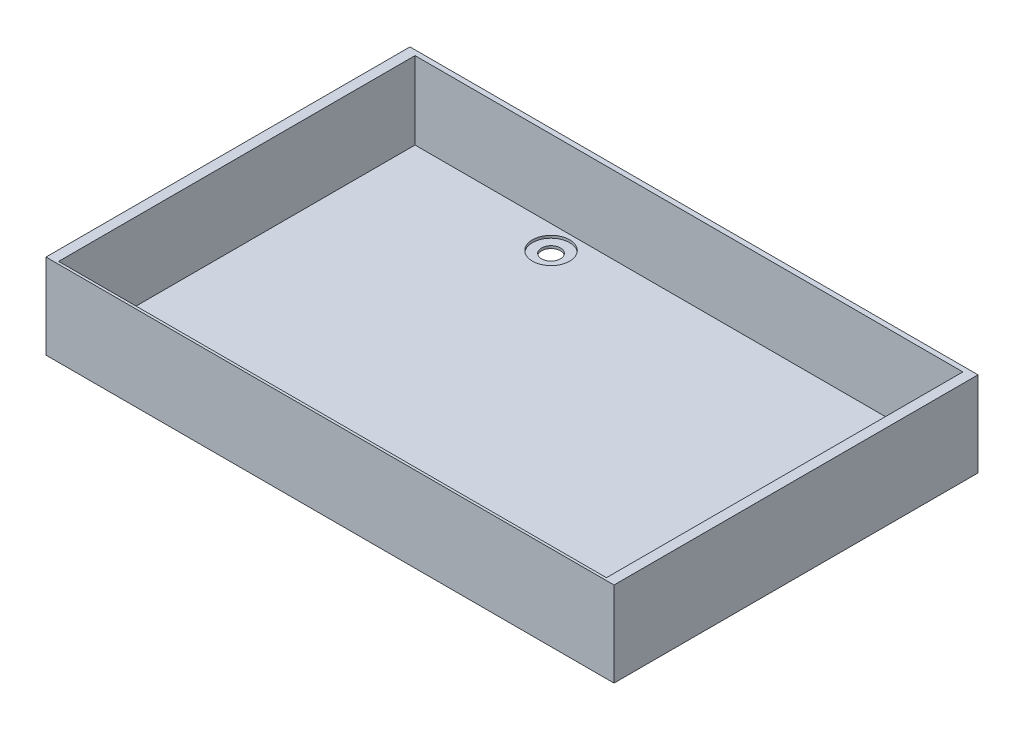
ISO-10303-21;
HEADER;
FILE_DESCRIPTION(('STEP AP214'),'2;1');
FILE_NAME('part.step','',(''),(''),'','','');
FILE_SCHEMA(('AUTOMOTIVE_DESIGN { 1 0 10303 214 1 1 1 1 }'));
ENDSEC;
DATA;
#1=APPLICATION_CONTEXT('core data for automotive mechanical design processes');
#2=APPLICATION_PROTOCOL_DEFINITION('international standard','automotive_design',2000,#1);
#3=PRODUCT_CONTEXT('',#1,'mechanical');
#4=PRODUCT('Part','Part','',(#3));
#5=PRODUCT_RELATED_PRODUCT_CATEGORY('part','',(#4));
#6=PRODUCT_DEFINITION_FORMATION('','',#4);
#7=PRODUCT_DEFINITION_CONTEXT('part definition',#1,'design');
#8=PRODUCT_DEFINITION('design','',#6,#7);
#9=PRODUCT_DEFINITION_SHAPE('','',#8);
#10=(LENGTH_UNIT() NAMED_UNIT(*) SI_UNIT(.MILLI.,.METRE.));
#11=(NAMED_UNIT(*) PLANE_ANGLE_UNIT() SI_UNIT($,.RADIAN.));
#12=(NAMED_UNIT(*) SI_UNIT($,.STERADIAN.) SOLID_ANGLE_UNIT());
#13=UNCERTAINTY_MEASURE_WITH_UNIT(LENGTH_MEASURE(1.E-05),#10,'distance_accuracy_value','');
#14=(GEOMETRIC_REPRESENTATION_CONTEXT(3) GLOBAL_UNCERTAINTY_ASSIGNED_CONTEXT((#13)) GLOBAL_UNIT_ASSIGNED_CONTEXT((#10,
#11,#12)) REPRESENTATION_CONTEXT('',''));
#15=CARTESIAN_POINT('',(0.,0.,0.));
#16=DIRECTION('',(0.,0.,1.));
#17=DIRECTION('',(1.,0.,0.));
#18=AXIS2_PLACEMENT_3D('',#15,#16,#17);
#19=CARTESIAN_POINT('',(84.9,-1.2,-53.3));
#20=DIRECTION('',(0.,1.,0.));
#21=DIRECTION('',(0.,0.,1.));
#22=AXIS2_PLACEMENT_3D('',#19,#20,#21);
#23=CYLINDRICAL_SURFACE('',#22,1.5);
#24=CARTESIAN_POINT('',(84.9,-0.8,-53.3));
#25=DIRECTION('',(0.,1.,0.));
#26=DIRECTION('',(0.,0.,1.));
#27=AXIS2_PLACEMENT_3D('',#24,#25,#26);
#28=CIRCLE('',#27,1.5);
#29=CARTESIAN_POINT('',(84.9,-0.8,-51.8));
#30=VERTEX_POINT('',#29);
#31=EDGE_CURVE('E122',#30,#30,#28,.F.);
#32=ORIENTED_EDGE('',*,*,#31,.T.);
#33=EDGE_LOOP('',(#32));
#34=FACE_BOUND('',#33,.T.);
#35=CARTESIAN_POINT('',(84.9,-0.4,-53.3));
#36=DIRECTION('',(0.,1.,0.));
#37=DIRECTION('',(0.,0.,1.));
#38=AXIS2_PLACEMENT_3D('',#35,#36,#37);
#39=CIRCLE('',#38,1.5);
#40=CARTESIAN_POINT('',(84.9,-0.4,-51.8));
#41=VERTEX_POINT('',#40);
#42=EDGE_CURVE('E39',#41,#41,#39,.F.);
#43=ORIENTED_EDGE('',*,*,#42,.F.);
#44=EDGE_LOOP('',(#43));
#45=FACE_BOUND('',#44,.T.);
#46=ADVANCED_FACE('F35',(#34,#45),#23,.F.);
#47=CARTESIAN_POINT('',(26.9,-1.2,-4.3));
#48=DIRECTION('',(0.,1.,0.));
#49=DIRECTION('',(0.,0.,1.));
#50=AXIS2_PLACEMENT_3D('',#47,#48,#49);
#51=CYLINDRICAL_SURFACE('',#50,1.5);
#52=CARTESIAN_POINT('',(26.9,-0.8,-4.3));
#53=DIRECTION('',(0.,1.,0.));
#54=DIRECTION('',(0.,0.,1.));
#55=AXIS2_PLACEMENT_3D('',#52,#53,#54);
#56=CIRCLE('',#55,1.5);
#57=CARTESIAN_POINT('',(26.9,-0.8,-2.8));
#58=VERTEX_POINT('',#57);
#59=EDGE_CURVE('E174',#58,#58,#56,.F.);
#60=ORIENTED_EDGE('',*,*,#59,.T.);
#61=EDGE_LOOP('',(#60));
#62=FACE_BOUND('',#61,.T.);
#63=CARTESIAN_POINT('',(26.9,-0.4,-4.3));
#64=DIRECTION('',(0.,1.,0.));
#65=DIRECTION('',(0.,0.,1.));
#66=AXIS2_PLACEMENT_3D('',#63,#64,#65);
#67=CIRCLE('',#66,1.5);
#68=CARTESIAN_POINT('',(26.9,-0.4,-2.8));
#69=VERTEX_POINT('',#68);
#70=EDGE_CURVE('E185',#69,#69,#67,.F.);
#71=ORIENTED_EDGE('',*,*,#70,.F.);
#72=EDGE_LOOP('',(#71));
#73=FACE_BOUND('',#72,.T.);
#74=ADVANCED_FACE('F239',(#62,#73),#51,.F.);
#75=CARTESIAN_POINT('',(84.9,-1.2,-4.3));
#76=DIRECTION('',(0.,1.,0.));
#77=DIRECTION('',(0.,0.,1.));
#78=AXIS2_PLACEMENT_3D('',#75,#76,#77);
#79=CYLINDRICAL_SURFACE('',#78,1.5);
#80=CARTESIAN_POINT('',(84.9,-0.8,-4.3));
#81=DIRECTION('',(0.,1.,0.));
#82=DIRECTION('',(0.,0.,1.));
#83=AXIS2_PLACEMENT_3D('',#80,#81,#82);
#84=CIRCLE('',#83,1.5);
#85=CARTESIAN_POINT('',(84.9,-0.8,-2.8));
#86=VERTEX_POINT('',#85);
#87=EDGE_CURVE('E170',#86,#86,#84,.F.);
#88=ORIENTED_EDGE('',*,*,#87,.T.);
#89=EDGE_LOOP('',(#88));
#90=FACE_BOUND('',#89,.T.);
#91=CARTESIAN_POINT('',(84.9,-0.4,-4.3));
#92=DIRECTION('',(0.,1.,0.));
#93=DIRECTION('',(0.,0.,1.));
#94=AXIS2_PLACEMENT_3D('',#91,#92,#93);
#95=CIRCLE('',#94,1.5);
#96=CARTESIAN_POINT('',(84.9,-0.4,-2.8));
#97=VERTEX_POINT('',#96);
#98=EDGE_CURVE('E182',#97,#97,#95,.F.);
#99=ORIENTED_EDGE('',*,*,#98,.F.);
#100=EDGE_LOOP('',(#99));
#101=FACE_BOUND('',#100,.T.);
#102=ADVANCED_FACE('F245',(#90,#101),#79,.F.);
#103=CARTESIAN_POINT('',(26.9,-1.2,-53.3));
#104=DIRECTION('',(0.,1.,0.));
#105=DIRECTION('',(0.,0.,1.));
#106=AXIS2_PLACEMENT_3D('',#103,#104,#105);
#107=CYLINDRICAL_SURFACE('',#106,1.5);
#108=CARTESIAN_POINT('',(26.9,-0.8,-53.3));
#109=DIRECTION('',(0.,1.,0.));
#110=DIRECTION('',(0.,0.,1.));
#111=AXIS2_PLACEMENT_3D('',#108,#109,#110);
#112=CIRCLE('',#111,1.5);
#113=CARTESIAN_POINT('',(26.9,-0.8,-51.8));
#114=VERTEX_POINT('',#113);
#115=EDGE_CURVE('E167',#114,#114,#112,.F.);
#116=ORIENTED_EDGE('',*,*,#115,.T.);
#117=EDGE_LOOP('',(#116));
#118=FACE_BOUND('',#117,.T.);
#119=CARTESIAN_POINT('',(26.9,-0.4,-53.3));
#120=DIRECTION('',(0.,1.,0.));
#121=DIRECTION('',(0.,0.,1.));
#122=AXIS2_PLACEMENT_3D('',#119,#120,#121);
#123=CIRCLE('',#122,1.5);
#124=CARTESIAN_POINT('',(26.9,-0.4,-51.8));
#125=VERTEX_POINT('',#124);
#126=EDGE_CURVE('E179',#125,#125,#123,.F.);
#127=ORIENTED_EDGE('',*,*,#126,.F.);
#128=EDGE_LOOP('',(#127));
#129=FACE_BOUND('',#128,.T.);
#130=ADVANCED_FACE('F277',(#118,#129),#107,.F.);
#131=CARTESIAN_POINT('',(0.,12.3,0.));
#132=DIRECTION('',(0.,-1.,0.));
#133=DIRECTION('',(0.,0.,-1.));
#134=AXIS2_PLACEMENT_3D('',#131,#132,#133);
#135=PLANE('',#134);
#136=DIRECTION('',(0.,0.,1.));
#137=VECTOR('',#136,1.);
#138=CARTESIAN_POINT('',(0.,12.3,0.));
#139=LINE('',#138,#137);
#140=CARTESIAN_POINT('',(0.,12.3,-57.8));
#141=VERTEX_POINT('',#140);
#142=CARTESIAN_POINT('',(0.,12.3,0.));
#143=VERTEX_POINT('',#142);
#144=EDGE_CURVE('E156',#141,#143,#139,.T.);
#145=ORIENTED_EDGE('',*,*,#144,.T.);
#146=DIRECTION('',(1.,0.,0.));
#147=VECTOR('',#146,1.);
#148=CARTESIAN_POINT('',(0.,12.3,0.));
#149=LINE('',#148,#147);
#150=CARTESIAN_POINT('',(90.2,12.3,0.));
#151=VERTEX_POINT('',#150);
#152=EDGE_CURVE('E159',#143,#151,#149,.T.);
#153=ORIENTED_EDGE('',*,*,#152,.T.);
#154=DIRECTION('',(0.,0.,-1.));
#155=VECTOR('',#154,1.);
#156=CARTESIAN_POINT('',(90.2,12.3,0.));
#157=LINE('',#156,#155);
#158=CARTESIAN_POINT('',(90.2,12.3,-57.8));
#159=VERTEX_POINT('',#158);
#160=EDGE_CURVE('E108',#151,#159,#157,.T.);
#161=ORIENTED_EDGE('',*,*,#160,.T.);
#162=DIRECTION('',(-1.,0.,0.));
#163=VECTOR('',#162,1.);
#164=CARTESIAN_POINT('',(0.,12.3,-57.8));
#165=LINE('',#164,#163);
#166=EDGE_CURVE('E162',#159,#141,#165,.T.);
#167=ORIENTED_EDGE('',*,*,#166,.T.);
#168=EDGE_LOOP('',(#145,#153,#161,#167));
#169=FACE_BOUND('',#168,.T.);
#170=DIRECTION('',(0.,0.,1.));
#171=VECTOR('',#170,1.);
#172=CARTESIAN_POINT('',(1.6,12.3,-0.4));
#173=LINE('',#172,#171);
#174=CARTESIAN_POINT('',(1.6,12.3,-57.));
#175=VERTEX_POINT('',#174);
#176=CARTESIAN_POINT('',(1.6,12.3,-0.4));
#177=VERTEX_POINT('',#176);
#178=EDGE_CURVE('E133',#175,#177,#173,.T.);
#179=ORIENTED_EDGE('',*,*,#178,.F.);
#180=DIRECTION('',(-1.,0.,0.));
#181=VECTOR('',#180,1.);
#182=CARTESIAN_POINT('',(1.6,12.3,-57.));
#183=LINE('',#182,#181);
#184=CARTESIAN_POINT('',(88.6,12.3,-57.));
#185=VERTEX_POINT('',#184);
#186=EDGE_CURVE('E140',#185,#175,#183,.T.);
#187=ORIENTED_EDGE('',*,*,#186,.F.);
#188=DIRECTION('',(0.,0.,-1.));
#189=VECTOR('',#188,1.);
#190=CARTESIAN_POINT('',(88.6,12.3,-0.4));
#191=LINE('',#190,#189);
#192=CARTESIAN_POINT('',(88.6,12.3,-0.4));
#193=VERTEX_POINT('',#192);
#194=EDGE_CURVE('E138',#193,#185,#191,.T.);
#195=ORIENTED_EDGE('',*,*,#194,.F.);
#196=DIRECTION('',(1.,0.,0.));
#197=VECTOR('',#196,1.);
#198=CARTESIAN_POINT('',(1.6,12.3,-0.4));
#199=LINE('',#198,#197);
#200=EDGE_CURVE('E135',#177,#193,#199,.T.);
#201=ORIENTED_EDGE('',*,*,#200,.F.);
#202=EDGE_LOOP('',(#179,#187,#195,#201));
#203=FACE_BOUND('',#202,.T.);
#204=ADVANCED_FACE('F274',(#169,#203),#135,.F.);
#205=CARTESIAN_POINT('',(0.,12.3,0.));
#206=DIRECTION('',(1.,0.,0.));
#207=DIRECTION('',(0.,0.,-1.));
#208=AXIS2_PLACEMENT_3D('',#205,#206,#207);
#209=PLANE('',#208);
#210=DIRECTION('',(0.,-1.,0.));
#211=VECTOR('',#210,1.);
#212=CARTESIAN_POINT('',(0.,12.3,-57.8));
#213=LINE('',#212,#211);
#214=CARTESIAN_POINT('',(0.,-1.20000000000001,-57.8));
#215=VERTEX_POINT('',#214);
#216=EDGE_CURVE('E164',#141,#215,#213,.T.);
#217=ORIENTED_EDGE('',*,*,#216,.T.);
#218=DIRECTION('',(0.,0.,-1.));
#219=VECTOR('',#218,1.);
#220=CARTESIAN_POINT('',(0.,-1.20000000000001,0.));
#221=LINE('',#220,#219);
#222=CARTESIAN_POINT('',(0.,-1.20000000000001,0.));
#223=VERTEX_POINT('',#222);
#224=EDGE_CURVE('E126',#223,#215,#221,.T.);
#225=ORIENTED_EDGE('',*,*,#224,.F.);
#226=DIRECTION('',(0.,-1.,0.));
#227=VECTOR('',#226,1.);
#228=CARTESIAN_POINT('',(0.,12.3,0.));
#229=LINE('',#228,#227);
#230=EDGE_CURVE('E11',#143,#223,#229,.T.);
#231=ORIENTED_EDGE('',*,*,#230,.F.);
#232=ORIENTED_EDGE('',*,*,#144,.F.);
#233=EDGE_LOOP('',(#217,#225,#231,#232));
#234=FACE_BOUND('',#233,.T.);
#235=ADVANCED_FACE('F37',(#234),#209,.F.);
#236=CARTESIAN_POINT('',(0.,12.3,0.));
#237=DIRECTION('',(0.,0.,-1.));
#238=DIRECTION('',(-1.,0.,0.));
#239=AXIS2_PLACEMENT_3D('',#236,#237,#238);
#240=PLANE('',#239);
#241=ORIENTED_EDGE('',*,*,#230,.T.);
#242=DIRECTION('',(-1.,0.,0.));
#243=VECTOR('',#242,1.);
#244=CARTESIAN_POINT('',(0.,-1.20000000000001,0.));
#245=LINE('',#244,#243);
#246=CARTESIAN_POINT('',(90.2,-1.20000000000001,0.));
#247=VERTEX_POINT('',#246);
#248=EDGE_CURVE('E118',#247,#223,#245,.T.);
#249=ORIENTED_EDGE('',*,*,#248,.F.);
#250=DIRECTION('',(0.,-1.,0.));
#251=VECTOR('',#250,1.);
#252=CARTESIAN_POINT('',(90.2,12.3,0.));
#253=LINE('',#252,#251);
#254=EDGE_CURVE('E44',#151,#247,#253,.T.);
#255=ORIENTED_EDGE('',*,*,#254,.F.);
#256=ORIENTED_EDGE('',*,*,#152,.F.);
#257=EDGE_LOOP('',(#241,#249,#255,#256));
#258=FACE_BOUND('',#257,.T.);
#259=ADVANCED_FACE('F124',(#258),#240,.F.);
#260=CARTESIAN_POINT('',(90.2,12.3,0.));
#261=DIRECTION('',(-1.,0.,0.));
#262=DIRECTION('',(0.,0.,1.));
#263=AXIS2_PLACEMENT_3D('',#260,#261,#262);
#264=PLANE('',#263);
#265=ORIENTED_EDGE('',*,*,#254,.T.);
#266=DIRECTION('',(0.,0.,1.));
#267=VECTOR('',#266,1.);
#268=CARTESIAN_POINT('',(90.2,-1.20000000000001,0.));
#269=LINE('',#268,#267);
#270=CARTESIAN_POINT('',(90.2,-1.20000000000001,-57.8));
#271=VERTEX_POINT('',#270);
#272=EDGE_CURVE('E107',#271,#247,#269,.T.);
#273=ORIENTED_EDGE('',*,*,#272,.F.);
#274=DIRECTION('',(0.,-1.,0.));
#275=VECTOR('',#274,1.);
#276=CARTESIAN_POINT('',(90.2,12.3,-57.8));
#277=LINE('',#276,#275);
#278=EDGE_CURVE('E111',#159,#271,#277,.T.);
#279=ORIENTED_EDGE('',*,*,#278,.F.);
#280=ORIENTED_EDGE('',*,*,#160,.F.);
#281=EDGE_LOOP('',(#265,#273,#279,#280));
#282=FACE_BOUND('',#281,.T.);
#283=ADVANCED_FACE('F105',(#282),#264,.F.);
#284=CARTESIAN_POINT('',(0.,12.3,-57.8));
#285=DIRECTION('',(0.,0.,1.));
#286=DIRECTION('',(1.,0.,0.));
#287=AXIS2_PLACEMENT_3D('',#284,#285,#286);
#288=PLANE('',#287);
#289=ORIENTED_EDGE('',*,*,#278,.T.);
#290=DIRECTION('',(1.,0.,0.));
#291=VECTOR('',#290,1.);
#292=CARTESIAN_POINT('',(0.,-1.20000000000001,-57.8));
#293=LINE('',#292,#291);
#294=EDGE_CURVE('E121',#215,#271,#293,.T.);
#295=ORIENTED_EDGE('',*,*,#294,.F.);
#296=ORIENTED_EDGE('',*,*,#216,.F.);
#297=ORIENTED_EDGE('',*,*,#166,.F.);
#298=EDGE_LOOP('',(#289,#295,#296,#297));
#299=FACE_BOUND('',#298,.T.);
#300=ADVANCED_FACE('F273',(#299),#288,.F.);
#301=CARTESIAN_POINT('',(1.6,12.3,-0.4));
#302=DIRECTION('',(1.,0.,0.));
#303=DIRECTION('',(0.,0.,-1.));
#304=AXIS2_PLACEMENT_3D('',#301,#302,#303);
#305=PLANE('',#304);
#306=DIRECTION('',(0.,0.,1.));
#307=VECTOR('',#306,1.);
#308=CARTESIAN_POINT('',(1.6,0.,-0.4));
#309=LINE('',#308,#307);
#310=CARTESIAN_POINT('',(1.6,0.,-57.));
#311=VERTEX_POINT('',#310);
#312=CARTESIAN_POINT('',(1.6,0.,-0.4));
#313=VERTEX_POINT('',#312);
#314=EDGE_CURVE('E60',#311,#313,#309,.T.);
#315=ORIENTED_EDGE('',*,*,#314,.F.);
#316=DIRECTION('',(0.,-1.,0.));
#317=VECTOR('',#316,1.);
#318=CARTESIAN_POINT('',(1.6,12.3,-57.));
#319=LINE('',#318,#317);
#320=EDGE_CURVE('E141',#175,#311,#319,.T.);
#321=ORIENTED_EDGE('',*,*,#320,.F.);
#322=ORIENTED_EDGE('',*,*,#178,.T.);
#323=DIRECTION('',(0.,-1.,0.));
#324=VECTOR('',#323,1.);
#325=CARTESIAN_POINT('',(1.6,12.3,-0.4));
#326=LINE('',#325,#324);
#327=EDGE_CURVE('E154',#177,#313,#326,.T.);
#328=ORIENTED_EDGE('',*,*,#327,.T.);
#329=EDGE_LOOP('',(#315,#321,#322,#328));
#330=FACE_BOUND('',#329,.T.);
#331=ADVANCED_FACE('F269',(#330),#305,.T.);
#332=CARTESIAN_POINT('',(1.6,12.3,-0.4));
#333=DIRECTION('',(0.,0.,-1.));
#334=DIRECTION('',(-1.,0.,0.));
#335=AXIS2_PLACEMENT_3D('',#332,#333,#334);
#336=PLANE('',#335);
#337=DIRECTION('',(1.,0.,0.));
#338=VECTOR('',#337,1.);
#339=CARTESIAN_POINT('',(1.6,0.,-0.4));
#340=LINE('',#339,#338);
#341=CARTESIAN_POINT('',(88.6,0.,-0.4));
#342=VERTEX_POINT('',#341);
#343=EDGE_CURVE('E128',#313,#342,#340,.T.);
#344=ORIENTED_EDGE('',*,*,#343,.F.);
#345=ORIENTED_EDGE('',*,*,#327,.F.);
#346=ORIENTED_EDGE('',*,*,#200,.T.);
#347=DIRECTION('',(0.,-1.,0.));
#348=VECTOR('',#347,1.);
#349=CARTESIAN_POINT('',(88.6,12.3,-0.4));
#350=LINE('',#349,#348);
#351=EDGE_CURVE('E152',#193,#342,#350,.T.);
#352=ORIENTED_EDGE('',*,*,#351,.T.);
#353=EDGE_LOOP('',(#344,#345,#346,#352));
#354=FACE_BOUND('',#353,.T.);
#355=ADVANCED_FACE('F265',(#354),#336,.T.);
#356=CARTESIAN_POINT('',(88.6,12.3,-0.4));
#357=DIRECTION('',(-1.,0.,0.));
#358=DIRECTION('',(0.,0.,1.));
#359=AXIS2_PLACEMENT_3D('',#356,#357,#358);
#360=PLANE('',#359);
#361=DIRECTION('',(0.,0.,-1.));
#362=VECTOR('',#361,1.);
#363=CARTESIAN_POINT('',(88.6,0.,-0.4));
#364=LINE('',#363,#362);
#365=CARTESIAN_POINT('',(88.6,0.,-57.));
#366=VERTEX_POINT('',#365);
#367=EDGE_CURVE('E145',#342,#366,#364,.T.);
#368=ORIENTED_EDGE('',*,*,#367,.F.);
#369=ORIENTED_EDGE('',*,*,#351,.F.);
#370=ORIENTED_EDGE('',*,*,#194,.T.);
#371=DIRECTION('',(0.,-1.,0.));
#372=VECTOR('',#371,1.);
#373=CARTESIAN_POINT('',(88.6,12.3,-57.));
#374=LINE('',#373,#372);
#375=EDGE_CURVE('E52',#185,#366,#374,.T.);
#376=ORIENTED_EDGE('',*,*,#375,.T.);
#377=EDGE_LOOP('',(#368,#369,#370,#376));
#378=FACE_BOUND('',#377,.T.);
#379=ADVANCED_FACE('F262',(#378),#360,.T.);
#380=CARTESIAN_POINT('',(1.6,12.3,-57.));
#381=DIRECTION('',(0.,0.,1.));
#382=DIRECTION('',(1.,0.,0.));
#383=AXIS2_PLACEMENT_3D('',#380,#381,#382);
#384=PLANE('',#383);
#385=DIRECTION('',(-1.,0.,0.));
#386=VECTOR('',#385,1.);
#387=CARTESIAN_POINT('',(1.6,0.,-57.));
#388=LINE('',#387,#386);
#389=EDGE_CURVE('E136',#366,#311,#388,.T.);
#390=ORIENTED_EDGE('',*,*,#389,.F.);
#391=ORIENTED_EDGE('',*,*,#375,.F.);
#392=ORIENTED_EDGE('',*,*,#186,.T.);
#393=ORIENTED_EDGE('',*,*,#320,.T.);
#394=EDGE_LOOP('',(#390,#391,#392,#393));
#395=FACE_BOUND('',#394,.T.);
#396=ADVANCED_FACE('F258',(#395),#384,.T.);
#397=CARTESIAN_POINT('',(0.,0.,0.));
#398=DIRECTION('',(0.,-1.,0.));
#399=DIRECTION('',(0.,0.,-1.));
#400=AXIS2_PLACEMENT_3D('',#397,#398,#399);
#401=PLANE('',#400);
#402=CARTESIAN_POINT('',(26.9,0.,-53.3));
#403=DIRECTION('',(0.,1.,0.));
#404=DIRECTION('',(0.,0.,1.));
#405=AXIS2_PLACEMENT_3D('',#402,#403,#404);
#406=CIRCLE('',#405,2.95);
#407=CARTESIAN_POINT('',(26.9,0.,-50.35));
#408=VERTEX_POINT('',#407);
#409=EDGE_CURVE('E551',#408,#408,#406,.T.);
#410=ORIENTED_EDGE('',*,*,#409,.F.);
#411=EDGE_LOOP('',(#410));
#412=FACE_BOUND('',#411,.T.);
#413=CARTESIAN_POINT('',(84.9,0.,-4.3));
#414=DIRECTION('',(0.,1.,0.));
#415=DIRECTION('',(0.,0.,1.));
#416=AXIS2_PLACEMENT_3D('',#413,#414,#415);
#417=CIRCLE('',#416,2.95);
#418=CARTESIAN_POINT('',(84.9,0.,-1.35));
#419=VERTEX_POINT('',#418);
#420=EDGE_CURVE('E554',#419,#419,#417,.T.);
#421=ORIENTED_EDGE('',*,*,#420,.F.);
#422=EDGE_LOOP('',(#421));
#423=FACE_BOUND('',#422,.T.);
#424=CARTESIAN_POINT('',(26.9,0.,-4.3));
#425=DIRECTION('',(0.,1.,0.));
#426=DIRECTION('',(0.,0.,1.));
#427=AXIS2_PLACEMENT_3D('',#424,#425,#426);
#428=CIRCLE('',#427,2.95);
#429=CARTESIAN_POINT('',(26.9,0.,-1.35));
#430=VERTEX_POINT('',#429);
#431=EDGE_CURVE('E563',#430,#430,#428,.T.);
#432=ORIENTED_EDGE('',*,*,#431,.F.);
#433=EDGE_LOOP('',(#432));
#434=FACE_BOUND('',#433,.T.);
#435=CARTESIAN_POINT('',(84.9,0.,-53.3));
#436=DIRECTION('',(0.,1.,0.));
#437=DIRECTION('',(0.,0.,1.));
#438=AXIS2_PLACEMENT_3D('',#435,#436,#437);
#439=CIRCLE('',#438,2.95);
#440=CARTESIAN_POINT('',(84.9,0.,-50.35));
#441=VERTEX_POINT('',#440);
#442=EDGE_CURVE('E546',#441,#441,#439,.T.);
#443=ORIENTED_EDGE('',*,*,#442,.F.);
#444=EDGE_LOOP('',(#443));
#445=FACE_BOUND('',#444,.T.);
#446=ORIENTED_EDGE('',*,*,#367,.T.);
#447=ORIENTED_EDGE('',*,*,#389,.T.);
#448=ORIENTED_EDGE('',*,*,#314,.T.);
#449=ORIENTED_EDGE('',*,*,#343,.T.);
#450=EDGE_LOOP('',(#446,#447,#448,#449));
#451=FACE_BOUND('',#450,.T.);
#452=ADVANCED_FACE('F254',(#412,#423,#434,#445,#451),#401,.F.);
#453=CARTESIAN_POINT('',(0.,-1.2,0.));
#454=DIRECTION('',(0.,1.,0.));
#455=DIRECTION('',(0.,0.,1.));
#456=AXIS2_PLACEMENT_3D('',#453,#454,#455);
#457=PLANE('',#456);
#458=CARTESIAN_POINT('',(26.9,-1.2,-53.3));
#459=DIRECTION('',(0.,1.,0.));
#460=DIRECTION('',(0.,0.,1.));
#461=AXIS2_PLACEMENT_3D('',#458,#459,#460);
#462=CIRCLE('',#461,2.45);
#463=CARTESIAN_POINT('',(26.9,-1.2,-50.85));
#464=VERTEX_POINT('',#463);
#465=EDGE_CURVE('E207',#464,#464,#462,.T.);
#466=ORIENTED_EDGE('',*,*,#465,.T.);
#467=EDGE_LOOP('',(#466));
#468=FACE_BOUND('',#467,.T.);
#469=CARTESIAN_POINT('',(84.9,-1.2,-4.3));
#470=DIRECTION('',(0.,1.,0.));
#471=DIRECTION('',(0.,0.,1.));
#472=AXIS2_PLACEMENT_3D('',#469,#470,#471);
#473=CIRCLE('',#472,2.45000000000001);
#474=CARTESIAN_POINT('',(84.9,-1.2,-1.84999999999999));
#475=VERTEX_POINT('',#474);
#476=EDGE_CURVE('E199',#475,#475,#473,.T.);
#477=ORIENTED_EDGE('',*,*,#476,.T.);
#478=EDGE_LOOP('',(#477));
#479=FACE_BOUND('',#478,.T.);
#480=CARTESIAN_POINT('',(26.9,-1.2,-4.3));
#481=DIRECTION('',(0.,1.,0.));
#482=DIRECTION('',(0.,0.,1.));
#483=AXIS2_PLACEMENT_3D('',#480,#481,#482);
#484=CIRCLE('',#483,2.45);
#485=CARTESIAN_POINT('',(26.9,-1.2,-1.85));
#486=VERTEX_POINT('',#485);
#487=EDGE_CURVE('E190',#486,#486,#484,.T.);
#488=ORIENTED_EDGE('',*,*,#487,.T.);
#489=EDGE_LOOP('',(#488));
#490=FACE_BOUND('',#489,.T.);
#491=CARTESIAN_POINT('',(84.9,-1.2,-53.3));
#492=DIRECTION('',(0.,1.,0.));
#493=DIRECTION('',(0.,0.,1.));
#494=AXIS2_PLACEMENT_3D('',#491,#492,#493);
#495=CIRCLE('',#494,2.45);
#496=CARTESIAN_POINT('',(84.9,-1.2,-50.85));
#497=VERTEX_POINT('',#496);
#498=EDGE_CURVE('E206',#497,#497,#495,.T.);
#499=ORIENTED_EDGE('',*,*,#498,.T.);
#500=EDGE_LOOP('',(#499));
#501=FACE_BOUND('',#500,.T.);
#502=ORIENTED_EDGE('',*,*,#224,.T.);
#503=ORIENTED_EDGE('',*,*,#294,.T.);
#504=ORIENTED_EDGE('',*,*,#272,.T.);
#505=ORIENTED_EDGE('',*,*,#248,.T.);
#506=EDGE_LOOP('',(#502,#503,#504,#505));
#507=FACE_BOUND('',#506,.T.);
#508=ADVANCED_FACE('F117',(#468,#479,#490,#501,#507),#457,.F.);
#509=CARTESIAN_POINT('',(26.9,-0.8,-53.3));
#510=DIRECTION('',(0.,1.,0.));
#511=DIRECTION('',(0.,0.,1.));
#512=AXIS2_PLACEMENT_3D('',#509,#510,#511);
#513=PLANE('',#512);
#514=CARTESIAN_POINT('',(26.9,-0.8,-53.3));
#515=DIRECTION('',(0.,1.,0.));
#516=DIRECTION('',(0.,0.,1.));
#517=AXIS2_PLACEMENT_3D('',#514,#515,#516);
#518=CIRCLE('',#517,2.45);
#519=CARTESIAN_POINT('',(26.9,-0.8,-50.85));
#520=VERTEX_POINT('',#519);
#521=EDGE_CURVE('E203',#520,#520,#518,.T.);
#522=ORIENTED_EDGE('',*,*,#521,.F.);
#523=EDGE_LOOP('',(#522));
#524=FACE_BOUND('',#523,.T.);
#525=ORIENTED_EDGE('',*,*,#115,.F.);
#526=EDGE_LOOP('',(#525));
#527=FACE_BOUND('',#526,.T.);
#528=ADVANCED_FACE('F253',(#524,#527),#513,.F.);
#529=CARTESIAN_POINT('',(26.9,-0.8,-53.3));
#530=DIRECTION('',(0.,-1.,0.));
#531=DIRECTION('',(0.,0.,-1.));
#532=AXIS2_PLACEMENT_3D('',#529,#530,#531);
#533=CYLINDRICAL_SURFACE('',#532,2.45);
#534=ORIENTED_EDGE('',*,*,#521,.T.);
#535=EDGE_LOOP('',(#534));
#536=FACE_BOUND('',#535,.T.);
#537=ORIENTED_EDGE('',*,*,#465,.F.);
#538=EDGE_LOOP('',(#537));
#539=FACE_BOUND('',#538,.T.);
#540=ADVANCED_FACE('F377',(#536,#539),#533,.F.);
#541=CARTESIAN_POINT('',(84.9,-0.8,-4.3));
#542=DIRECTION('',(0.,1.,0.));
#543=DIRECTION('',(0.,0.,1.));
#544=AXIS2_PLACEMENT_3D('',#541,#542,#543);
#545=PLANE('',#544);
#546=CARTESIAN_POINT('',(84.9,-0.8,-4.3));
#547=DIRECTION('',(0.,1.,0.));
#548=DIRECTION('',(0.,0.,1.));
#549=AXIS2_PLACEMENT_3D('',#546,#547,#548);
#550=CIRCLE('',#549,2.45000000000001);
#551=CARTESIAN_POINT('',(84.9,-0.8,-1.84999999999999));
#552=VERTEX_POINT('',#551);
#553=EDGE_CURVE('E210',#552,#552,#550,.T.);
#554=ORIENTED_EDGE('',*,*,#553,.F.);
#555=EDGE_LOOP('',(#554));
#556=FACE_BOUND('',#555,.T.);
#557=ORIENTED_EDGE('',*,*,#87,.F.);
#558=EDGE_LOOP('',(#557));
#559=FACE_BOUND('',#558,.T.);
#560=ADVANCED_FACE('F367',(#556,#559),#545,.F.);
#561=CARTESIAN_POINT('',(84.9,-0.8,-4.3));
#562=DIRECTION('',(0.,-1.,0.));
#563=DIRECTION('',(0.,0.,-1.));
#564=AXIS2_PLACEMENT_3D('',#561,#562,#563);
#565=CYLINDRICAL_SURFACE('',#564,2.45000000000001);
#566=ORIENTED_EDGE('',*,*,#553,.T.);
#567=EDGE_LOOP('',(#566));
#568=FACE_BOUND('',#567,.T.);
#569=ORIENTED_EDGE('',*,*,#476,.F.);
#570=EDGE_LOOP('',(#569));
#571=FACE_BOUND('',#570,.T.);
#572=ADVANCED_FACE('F357',(#568,#571),#565,.F.);
#573=CARTESIAN_POINT('',(26.9,-0.8,-4.3));
#574=DIRECTION('',(0.,1.,0.));
#575=DIRECTION('',(0.,0.,1.));
#576=AXIS2_PLACEMENT_3D('',#573,#574,#575);
#577=PLANE('',#576);
#578=CARTESIAN_POINT('',(26.9,-0.8,-4.3));
#579=DIRECTION('',(0.,1.,0.));
#580=DIRECTION('',(0.,0.,1.));
#581=AXIS2_PLACEMENT_3D('',#578,#579,#580);
#582=CIRCLE('',#581,2.45);
#583=CARTESIAN_POINT('',(26.9,-0.8,-1.85));
#584=VERTEX_POINT('',#583);
#585=EDGE_CURVE('E194',#584,#584,#582,.T.);
#586=ORIENTED_EDGE('',*,*,#585,.F.);
#587=EDGE_LOOP('',(#586));
#588=FACE_BOUND('',#587,.T.);
#589=ORIENTED_EDGE('',*,*,#59,.F.);
#590=EDGE_LOOP('',(#589));
#591=FACE_BOUND('',#590,.T.);
#592=ADVANCED_FACE('F347',(#588,#591),#577,.F.);
#593=CARTESIAN_POINT('',(26.9,-0.8,-4.3));
#594=DIRECTION('',(0.,-1.,0.));
#595=DIRECTION('',(0.,0.,-1.));
#596=AXIS2_PLACEMENT_3D('',#593,#594,#595);
#597=CYLINDRICAL_SURFACE('',#596,2.45);
#598=ORIENTED_EDGE('',*,*,#585,.T.);
#599=EDGE_LOOP('',(#598));
#600=FACE_BOUND('',#599,.T.);
#601=ORIENTED_EDGE('',*,*,#487,.F.);
#602=EDGE_LOOP('',(#601));
#603=FACE_BOUND('',#602,.T.);
#604=ADVANCED_FACE('F234',(#600,#603),#597,.F.);
#605=CARTESIAN_POINT('',(84.9,-0.8,-53.3));
#606=DIRECTION('',(0.,1.,0.));
#607=DIRECTION('',(0.,0.,1.));
#608=AXIS2_PLACEMENT_3D('',#605,#606,#607);
#609=PLANE('',#608);
#610=CARTESIAN_POINT('',(84.9,-0.8,-53.3));
#611=DIRECTION('',(0.,1.,0.));
#612=DIRECTION('',(0.,0.,1.));
#613=AXIS2_PLACEMENT_3D('',#610,#611,#612);
#614=CIRCLE('',#613,2.45);
#615=CARTESIAN_POINT('',(84.9,-0.8,-50.85));
#616=VERTEX_POINT('',#615);
#617=EDGE_CURVE('E171',#616,#616,#614,.T.);
#618=ORIENTED_EDGE('',*,*,#617,.F.);
#619=EDGE_LOOP('',(#618));
#620=FACE_BOUND('',#619,.T.);
#621=ORIENTED_EDGE('',*,*,#31,.F.);
#622=EDGE_LOOP('',(#621));
#623=FACE_BOUND('',#622,.T.);
#624=ADVANCED_FACE('F224',(#620,#623),#609,.F.);
#625=CARTESIAN_POINT('',(84.9,-0.8,-53.3));
#626=DIRECTION('',(0.,-1.,0.));
#627=DIRECTION('',(0.,0.,-1.));
#628=AXIS2_PLACEMENT_3D('',#625,#626,#627);
#629=CYLINDRICAL_SURFACE('',#628,2.45);
#630=ORIENTED_EDGE('',*,*,#617,.T.);
#631=EDGE_LOOP('',(#630));
#632=FACE_BOUND('',#631,.T.);
#633=ORIENTED_EDGE('',*,*,#498,.F.);
#634=EDGE_LOOP('',(#633));
#635=FACE_BOUND('',#634,.T.);
#636=ADVANCED_FACE('F221',(#632,#635),#629,.F.);
#637=CARTESIAN_POINT('',(26.9,-0.4,-53.3));
#638=DIRECTION('',(0.,1.,0.));
#639=DIRECTION('',(0.,0.,1.));
#640=AXIS2_PLACEMENT_3D('',#637,#638,#639);
#641=PLANE('',#640);
#642=CARTESIAN_POINT('',(26.9,-0.4,-53.3));
#643=DIRECTION('',(0.,1.,0.));
#644=DIRECTION('',(0.,0.,1.));
#645=AXIS2_PLACEMENT_3D('',#642,#643,#644);
#646=CIRCLE('',#645,2.95);
#647=CARTESIAN_POINT('',(26.9,-0.4,-50.35));
#648=VERTEX_POINT('',#647);
#649=EDGE_CURVE('E548',#648,#648,#646,.T.);
#650=ORIENTED_EDGE('',*,*,#649,.T.);
#651=EDGE_LOOP('',(#650));
#652=FACE_BOUND('',#651,.T.);
#653=ORIENTED_EDGE('',*,*,#126,.T.);
#654=EDGE_LOOP('',(#653));
#655=FACE_BOUND('',#654,.T.);
#656=ADVANCED_FACE('F223',(#652,#655),#641,.T.);
#657=CARTESIAN_POINT('',(26.9,-0.4,-53.3));
#658=DIRECTION('',(0.,1.,0.));
#659=DIRECTION('',(0.,0.,1.));
#660=AXIS2_PLACEMENT_3D('',#657,#658,#659);
#661=CYLINDRICAL_SURFACE('',#660,2.95);
#662=ORIENTED_EDGE('',*,*,#649,.F.);
#663=EDGE_LOOP('',(#662));
#664=FACE_BOUND('',#663,.T.);
#665=ORIENTED_EDGE('',*,*,#409,.T.);
#666=EDGE_LOOP('',(#665));
#667=FACE_BOUND('',#666,.T.);
#668=ADVANCED_FACE('F231',(#664,#667),#661,.F.);
#669=CARTESIAN_POINT('',(84.9,-0.4,-4.3));
#670=DIRECTION('',(0.,1.,0.));
#671=DIRECTION('',(0.,0.,1.));
#672=AXIS2_PLACEMENT_3D('',#669,#670,#671);
#673=PLANE('',#672);
#674=CARTESIAN_POINT('',(84.9,-0.4,-4.3));
#675=DIRECTION('',(0.,1.,0.));
#676=DIRECTION('',(0.,0.,1.));
#677=AXIS2_PLACEMENT_3D('',#674,#675,#676);
#678=CIRCLE('',#677,2.95);
#679=CARTESIAN_POINT('',(84.9,-0.4,-1.35));
#680=VERTEX_POINT('',#679);
#681=EDGE_CURVE('E557',#680,#680,#678,.T.);
#682=ORIENTED_EDGE('',*,*,#681,.T.);
#683=EDGE_LOOP('',(#682));
#684=FACE_BOUND('',#683,.T.);
#685=ORIENTED_EDGE('',*,*,#98,.T.);
#686=EDGE_LOOP('',(#685));
#687=FACE_BOUND('',#686,.T.);
#688=ADVANCED_FACE('F477',(#684,#687),#673,.T.);
#689=CARTESIAN_POINT('',(84.9,-0.4,-4.3));
#690=DIRECTION('',(0.,1.,0.));
#691=DIRECTION('',(0.,0.,1.));
#692=AXIS2_PLACEMENT_3D('',#689,#690,#691);
#693=CYLINDRICAL_SURFACE('',#692,2.95);
#694=ORIENTED_EDGE('',*,*,#681,.F.);
#695=EDGE_LOOP('',(#694));
#696=FACE_BOUND('',#695,.T.);
#697=ORIENTED_EDGE('',*,*,#420,.T.);
#698=EDGE_LOOP('',(#697));
#699=FACE_BOUND('',#698,.T.);
#700=ADVANCED_FACE('F487',(#696,#699),#693,.F.);
#701=CARTESIAN_POINT('',(26.9,-0.4,-4.3));
#702=DIRECTION('',(0.,1.,0.));
#703=DIRECTION('',(0.,0.,1.));
#704=AXIS2_PLACEMENT_3D('',#701,#702,#703);
#705=PLANE('',#704);
#706=CARTESIAN_POINT('',(26.9,-0.4,-4.3));
#707=DIRECTION('',(0.,1.,0.));
#708=DIRECTION('',(0.,0.,1.));
#709=AXIS2_PLACEMENT_3D('',#706,#707,#708);
#710=CIRCLE('',#709,2.95);
#711=CARTESIAN_POINT('',(26.9,-0.4,-1.35));
#712=VERTEX_POINT('',#711);
#713=EDGE_CURVE('E558',#712,#712,#710,.T.);
#714=ORIENTED_EDGE('',*,*,#713,.T.);
#715=EDGE_LOOP('',(#714));
#716=FACE_BOUND('',#715,.T.);
#717=ORIENTED_EDGE('',*,*,#70,.T.);
#718=EDGE_LOOP('',(#717));
#719=FACE_BOUND('',#718,.T.);
#720=ADVANCED_FACE('F497',(#716,#719),#705,.T.);
#721=CARTESIAN_POINT('',(26.9,-0.4,-4.3));
#722=DIRECTION('',(0.,1.,0.));
#723=DIRECTION('',(0.,0.,1.));
#724=AXIS2_PLACEMENT_3D('',#721,#722,#723);
#725=CYLINDRICAL_SURFACE('',#724,2.95);
#726=ORIENTED_EDGE('',*,*,#713,.F.);
#727=EDGE_LOOP('',(#726));
#728=FACE_BOUND('',#727,.T.);
#729=ORIENTED_EDGE('',*,*,#431,.T.);
#730=EDGE_LOOP('',(#729));
#731=FACE_BOUND('',#730,.T.);
#732=ADVANCED_FACE('F507',(#728,#731),#725,.F.);
#733=CARTESIAN_POINT('',(84.9,-0.4,-53.3));
#734=DIRECTION('',(0.,1.,0.));
#735=DIRECTION('',(0.,0.,1.));
#736=AXIS2_PLACEMENT_3D('',#733,#734,#735);
#737=PLANE('',#736);
#738=CARTESIAN_POINT('',(84.9,-0.4,-53.3));
#739=DIRECTION('',(0.,1.,0.));
#740=DIRECTION('',(0.,0.,1.));
#741=AXIS2_PLACEMENT_3D('',#738,#739,#740);
#742=CIRCLE('',#741,2.95);
#743=CARTESIAN_POINT('',(84.9,-0.4,-50.35));
#744=VERTEX_POINT('',#743);
#745=EDGE_CURVE('E183',#744,#744,#742,.T.);
#746=ORIENTED_EDGE('',*,*,#745,.T.);
#747=EDGE_LOOP('',(#746));
#748=FACE_BOUND('',#747,.T.);
#749=ORIENTED_EDGE('',*,*,#42,.T.);
#750=EDGE_LOOP('',(#749));
#751=FACE_BOUND('',#750,.T.);
#752=ADVANCED_FACE('F517',(#748,#751),#737,.T.);
#753=CARTESIAN_POINT('',(84.9,-0.4,-53.3));
#754=DIRECTION('',(0.,1.,0.));
#755=DIRECTION('',(0.,0.,1.));
#756=AXIS2_PLACEMENT_3D('',#753,#754,#755);
#757=CYLINDRICAL_SURFACE('',#756,2.95);
#758=ORIENTED_EDGE('',*,*,#745,.F.);
#759=EDGE_LOOP('',(#758));
#760=FACE_BOUND('',#759,.T.);
#761=ORIENTED_EDGE('',*,*,#442,.T.);
#762=EDGE_LOOP('',(#761));
#763=FACE_BOUND('',#762,.T.);
#764=ADVANCED_FACE('F527',(#760,#763),#757,.F.);
#765=CLOSED_SHELL('',(#46,#74,#102,#130,#204,#235,#259,#283,#300,#331,#355,#379,#396,#452,#508,
#528,#540,#560,#572,#592,#604,#624,#636,#656,#668,#688,#700,#720,#732,#752,#764));
#766=MANIFOLD_SOLID_BREP('B2',#765);
#767=ADVANCED_BREP_SHAPE_REPRESENTATION('',(#18,#766),#14);
#768=SHAPE_DEFINITION_REPRESENTATION(#9,#767);
ENDSEC;
END-ISO-10303-21;
